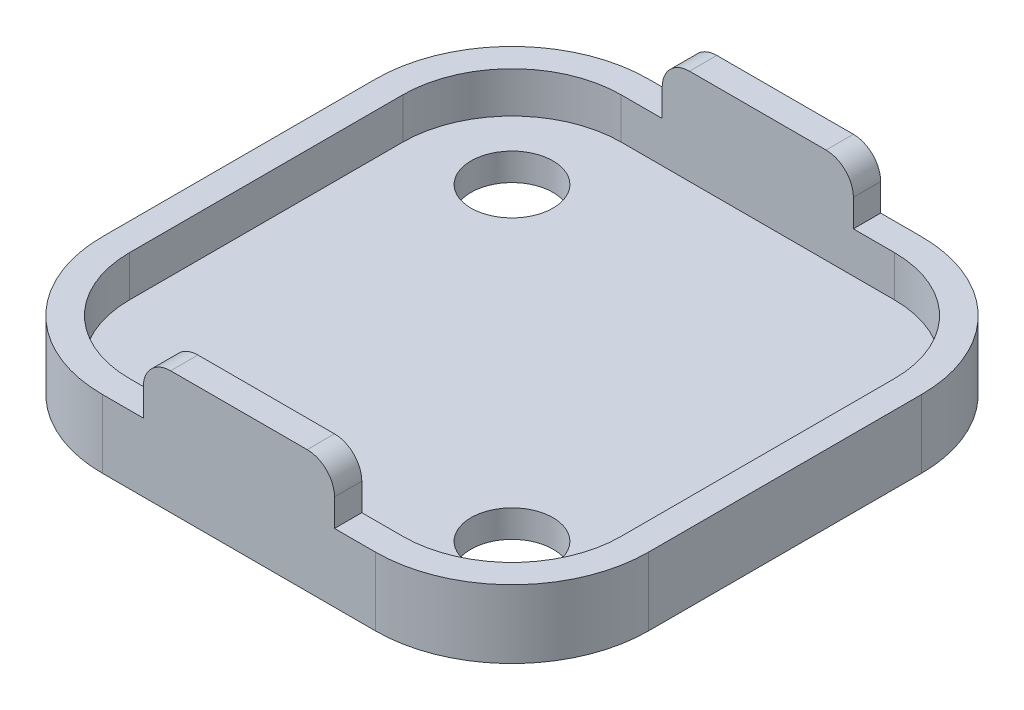
ISO-10303-21;
HEADER;
FILE_DESCRIPTION(('STEP AP214'),'2;1');
FILE_NAME('part.step','',(''),(''),'','','');
FILE_SCHEMA(('AUTOMOTIVE_DESIGN { 1 0 10303 214 1 1 1 1 }'));
ENDSEC;
DATA;
#1=APPLICATION_CONTEXT('core data for automotive mechanical design processes');
#2=APPLICATION_PROTOCOL_DEFINITION('international standard','automotive_design',2000,#1);
#3=PRODUCT_CONTEXT('',#1,'mechanical');
#4=PRODUCT('Part','Part','',(#3));
#5=PRODUCT_RELATED_PRODUCT_CATEGORY('part','',(#4));
#6=PRODUCT_DEFINITION_FORMATION('','',#4);
#7=PRODUCT_DEFINITION_CONTEXT('part definition',#1,'design');
#8=PRODUCT_DEFINITION('design','',#6,#7);
#9=PRODUCT_DEFINITION_SHAPE('','',#8);
#10=(LENGTH_UNIT() NAMED_UNIT(*) SI_UNIT(.MILLI.,.METRE.));
#11=(NAMED_UNIT(*) PLANE_ANGLE_UNIT() SI_UNIT($,.RADIAN.));
#12=(NAMED_UNIT(*) SI_UNIT($,.STERADIAN.) SOLID_ANGLE_UNIT());
#13=UNCERTAINTY_MEASURE_WITH_UNIT(LENGTH_MEASURE(1.E-05),#10,'distance_accuracy_value','');
#14=(GEOMETRIC_REPRESENTATION_CONTEXT(3) GLOBAL_UNCERTAINTY_ASSIGNED_CONTEXT((#13)) GLOBAL_UNIT_ASSIGNED_CONTEXT((#10,
#11,#12)) REPRESENTATION_CONTEXT('',''));
#15=CARTESIAN_POINT('',(0.,0.,0.));
#16=DIRECTION('',(0.,0.,1.));
#17=DIRECTION('',(1.,0.,0.));
#18=AXIS2_PLACEMENT_3D('',#15,#16,#17);
#19=CARTESIAN_POINT('',(0.,2.5,0.));
#20=DIRECTION('',(0.,-1.,0.));
#21=DIRECTION('',(0.,0.,-1.));
#22=AXIS2_PLACEMENT_3D('',#19,#20,#21);
#23=PLANE('',#22);
#24=DIRECTION('',(0.,0.,1.));
#25=VECTOR('',#24,1.);
#26=CARTESIAN_POINT('',(-3.49999999999944,2.5,0.));
#27=LINE('',#26,#25);
#28=CARTESIAN_POINT('',(-3.49999999999944,2.5,9.));
#29=VERTEX_POINT('',#28);
#30=CARTESIAN_POINT('',(-3.49999999999944,2.5,10.));
#31=VERTEX_POINT('',#30);
#32=EDGE_CURVE('E224',#29,#31,#27,.T.);
#33=ORIENTED_EDGE('',*,*,#32,.F.);
#34=DIRECTION('',(1.,0.,0.));
#35=VECTOR('',#34,1.);
#36=CARTESIAN_POINT('',(-5.,2.5,9.));
#37=LINE('',#36,#35);
#38=CARTESIAN_POINT('',(-5.,2.5,9.));
#39=VERTEX_POINT('',#38);
#40=EDGE_CURVE('E237',#39,#29,#37,.T.);
#41=ORIENTED_EDGE('',*,*,#40,.F.);
#42=CARTESIAN_POINT('',(-5.,2.5,5.));
#43=DIRECTION('',(0.,1.,0.));
#44=DIRECTION('',(0.,0.,1.));
#45=AXIS2_PLACEMENT_3D('',#42,#43,#44);
#46=CIRCLE('',#45,4.);
#47=CARTESIAN_POINT('',(-9.,2.5,5.));
#48=VERTEX_POINT('',#47);
#49=EDGE_CURVE('E253',#48,#39,#46,.T.);
#50=ORIENTED_EDGE('',*,*,#49,.F.);
#51=DIRECTION('',(0.,0.,1.));
#52=VECTOR('',#51,1.);
#53=CARTESIAN_POINT('',(-9.,2.5,-5.));
#54=LINE('',#53,#52);
#55=CARTESIAN_POINT('',(-9.,2.5,-5.));
#56=VERTEX_POINT('',#55);
#57=EDGE_CURVE('E443',#56,#48,#54,.T.);
#58=ORIENTED_EDGE('',*,*,#57,.F.);
#59=CARTESIAN_POINT('',(-5.,2.5,-5.));
#60=DIRECTION('',(0.,1.,0.));
#61=DIRECTION('',(0.,0.,1.));
#62=AXIS2_PLACEMENT_3D('',#59,#60,#61);
#63=CIRCLE('',#62,4.);
#64=CARTESIAN_POINT('',(-5.,2.5,-9.));
#65=VERTEX_POINT('',#64);
#66=EDGE_CURVE('E441',#65,#56,#63,.T.);
#67=ORIENTED_EDGE('',*,*,#66,.F.);
#68=DIRECTION('',(-1.,0.,0.));
#69=VECTOR('',#68,1.);
#70=CARTESIAN_POINT('',(5.,2.5,-9.));
#71=LINE('',#70,#69);
#72=CARTESIAN_POINT('',(-3.49999999999943,2.5,-9.));
#73=VERTEX_POINT('',#72);
#74=EDGE_CURVE('E438',#73,#65,#71,.T.);
#75=ORIENTED_EDGE('',*,*,#74,.F.);
#76=DIRECTION('',(0.,0.,1.));
#77=VECTOR('',#76,1.);
#78=CARTESIAN_POINT('',(-3.49999999999944,2.5,0.));
#79=LINE('',#78,#77);
#80=CARTESIAN_POINT('',(-3.49999999999943,2.5,-10.));
#81=VERTEX_POINT('',#80);
#82=EDGE_CURVE('E231',#81,#73,#79,.T.);
#83=ORIENTED_EDGE('',*,*,#82,.F.);
#84=DIRECTION('',(-1.,0.,0.));
#85=VECTOR('',#84,1.);
#86=CARTESIAN_POINT('',(-10.,2.5,-10.));
#87=LINE('',#86,#85);
#88=CARTESIAN_POINT('',(-5.,2.5,-10.));
#89=VERTEX_POINT('',#88);
#90=EDGE_CURVE('E287',#81,#89,#87,.T.);
#91=ORIENTED_EDGE('',*,*,#90,.T.);
#92=CARTESIAN_POINT('',(-5.,2.5,-5.));
#93=DIRECTION('',(0.,-1.,0.));
#94=DIRECTION('',(0.,0.,-1.));
#95=AXIS2_PLACEMENT_3D('',#92,#93,#94);
#96=CIRCLE('',#95,5.);
#97=CARTESIAN_POINT('',(-10.,2.5,-5.));
#98=VERTEX_POINT('',#97);
#99=EDGE_CURVE('E334',#89,#98,#96,.F.);
#100=ORIENTED_EDGE('',*,*,#99,.T.);
#101=DIRECTION('',(0.,0.,1.));
#102=VECTOR('',#101,1.);
#103=CARTESIAN_POINT('',(-10.,2.5,10.));
#104=LINE('',#103,#102);
#105=CARTESIAN_POINT('',(-10.,2.5,5.));
#106=VERTEX_POINT('',#105);
#107=EDGE_CURVE('E292',#98,#106,#104,.T.);
#108=ORIENTED_EDGE('',*,*,#107,.T.);
#109=CARTESIAN_POINT('',(-5.,2.5,5.));
#110=DIRECTION('',(0.,-1.,0.));
#111=DIRECTION('',(0.,0.,-1.));
#112=AXIS2_PLACEMENT_3D('',#109,#110,#111);
#113=CIRCLE('',#112,5.);
#114=CARTESIAN_POINT('',(-5.,2.5,10.));
#115=VERTEX_POINT('',#114);
#116=EDGE_CURVE('E332',#106,#115,#113,.F.);
#117=ORIENTED_EDGE('',*,*,#116,.T.);
#118=DIRECTION('',(1.,0.,0.));
#119=VECTOR('',#118,1.);
#120=CARTESIAN_POINT('',(-10.,2.5,10.));
#121=LINE('',#120,#119);
#122=EDGE_CURVE('E239',#115,#31,#121,.T.);
#123=ORIENTED_EDGE('',*,*,#122,.T.);
#124=EDGE_LOOP('',(#33,#41,#50,#58,#67,#75,#83,#91,#100,#108,#117,#123));
#125=FACE_BOUND('',#124,.T.);
#126=ADVANCED_FACE('F35',(#125),#23,.F.);
#127=DIRECTION('',(0.,0.,-1.));
#128=VECTOR('',#127,1.);
#129=CARTESIAN_POINT('',(3.50000000000056,2.5,0.));
#130=LINE('',#129,#128);
#131=CARTESIAN_POINT('',(3.50000000000056,2.5,10.));
#132=VERTEX_POINT('',#131);
#133=CARTESIAN_POINT('',(3.50000000000056,2.5,9.));
#134=VERTEX_POINT('',#133);
#135=EDGE_CURVE('E240',#132,#134,#130,.T.);
#136=ORIENTED_EDGE('',*,*,#135,.F.);
#137=CARTESIAN_POINT('',(5.,2.5,10.));
#138=VERTEX_POINT('',#137);
#139=EDGE_CURVE('E295',#132,#138,#121,.T.);
#140=ORIENTED_EDGE('',*,*,#139,.T.);
#141=CARTESIAN_POINT('',(5.,2.5,5.));
#142=DIRECTION('',(0.,-1.,0.));
#143=DIRECTION('',(0.,0.,-1.));
#144=AXIS2_PLACEMENT_3D('',#141,#142,#143);
#145=CIRCLE('',#144,5.);
#146=CARTESIAN_POINT('',(10.,2.5,5.));
#147=VERTEX_POINT('',#146);
#148=EDGE_CURVE('E328',#138,#147,#145,.F.);
#149=ORIENTED_EDGE('',*,*,#148,.T.);
#150=DIRECTION('',(0.,0.,-1.));
#151=VECTOR('',#150,1.);
#152=CARTESIAN_POINT('',(10.,2.5,10.));
#153=LINE('',#152,#151);
#154=CARTESIAN_POINT('',(10.,2.5,-5.));
#155=VERTEX_POINT('',#154);
#156=EDGE_CURVE('E284',#147,#155,#153,.T.);
#157=ORIENTED_EDGE('',*,*,#156,.T.);
#158=CARTESIAN_POINT('',(5.,2.5,-5.));
#159=DIRECTION('',(0.,-1.,0.));
#160=DIRECTION('',(0.,0.,-1.));
#161=AXIS2_PLACEMENT_3D('',#158,#159,#160);
#162=CIRCLE('',#161,5.);
#163=CARTESIAN_POINT('',(5.,2.5,-10.));
#164=VERTEX_POINT('',#163);
#165=EDGE_CURVE('E330',#155,#164,#162,.F.);
#166=ORIENTED_EDGE('',*,*,#165,.T.);
#167=CARTESIAN_POINT('',(3.50000000000056,2.5,-10.));
#168=VERTEX_POINT('',#167);
#169=EDGE_CURVE('E289',#164,#168,#87,.T.);
#170=ORIENTED_EDGE('',*,*,#169,.T.);
#171=DIRECTION('',(0.,0.,-1.));
#172=VECTOR('',#171,1.);
#173=CARTESIAN_POINT('',(3.50000000000056,2.5,0.));
#174=LINE('',#173,#172);
#175=CARTESIAN_POINT('',(3.50000000000056,2.5,-9.));
#176=VERTEX_POINT('',#175);
#177=EDGE_CURVE('E404',#176,#168,#174,.T.);
#178=ORIENTED_EDGE('',*,*,#177,.F.);
#179=CARTESIAN_POINT('',(5.,2.5,-9.));
#180=VERTEX_POINT('',#179);
#181=EDGE_CURVE('E439',#180,#176,#71,.T.);
#182=ORIENTED_EDGE('',*,*,#181,.F.);
#183=CARTESIAN_POINT('',(5.,2.5,-5.));
#184=DIRECTION('',(0.,1.,0.));
#185=DIRECTION('',(0.,0.,1.));
#186=AXIS2_PLACEMENT_3D('',#183,#184,#185);
#187=CIRCLE('',#186,4.);
#188=CARTESIAN_POINT('',(9.,2.5,-5.));
#189=VERTEX_POINT('',#188);
#190=EDGE_CURVE('E414',#189,#180,#187,.T.);
#191=ORIENTED_EDGE('',*,*,#190,.F.);
#192=DIRECTION('',(0.,0.,-1.));
#193=VECTOR('',#192,1.);
#194=CARTESIAN_POINT('',(9.,2.5,5.));
#195=LINE('',#194,#193);
#196=CARTESIAN_POINT('',(9.,2.5,5.));
#197=VERTEX_POINT('',#196);
#198=EDGE_CURVE('E251',#197,#189,#195,.T.);
#199=ORIENTED_EDGE('',*,*,#198,.F.);
#200=CARTESIAN_POINT('',(5.,2.5,5.));
#201=DIRECTION('',(0.,1.,0.));
#202=DIRECTION('',(0.,0.,1.));
#203=AXIS2_PLACEMENT_3D('',#200,#201,#202);
#204=CIRCLE('',#203,4.);
#205=CARTESIAN_POINT('',(5.,2.5,9.));
#206=VERTEX_POINT('',#205);
#207=EDGE_CURVE('E247',#206,#197,#204,.T.);
#208=ORIENTED_EDGE('',*,*,#207,.F.);
#209=EDGE_CURVE('E248',#134,#206,#37,.T.);
#210=ORIENTED_EDGE('',*,*,#209,.F.);
#211=EDGE_LOOP('',(#136,#140,#149,#157,#166,#170,#178,#182,#191,#199,#208,#210));
#212=FACE_BOUND('',#211,.T.);
#213=ADVANCED_FACE('F502',(#212),#23,.F.);
#214=CARTESIAN_POINT('',(-5.65685424949239,-7.5,-5.65685424949237));
#215=DIRECTION('',(0.,1.,0.));
#216=DIRECTION('',(0.,0.,1.));
#217=AXIS2_PLACEMENT_3D('',#214,#215,#216);
#218=CYLINDRICAL_SURFACE('',#217,1.50000000000001);
#219=CARTESIAN_POINT('',(-5.65685424949239,0.,-5.65685424949237));
#220=DIRECTION('',(0.,-1.,0.));
#221=DIRECTION('',(0.,0.,-1.));
#222=AXIS2_PLACEMENT_3D('',#219,#220,#221);
#223=CIRCLE('',#222,1.50000000000001);
#224=CARTESIAN_POINT('',(-5.65685424949239,0.,-7.15685424949238));
#225=VERTEX_POINT('',#224);
#226=EDGE_CURVE('E283',#225,#225,#223,.T.);
#227=ORIENTED_EDGE('',*,*,#226,.T.);
#228=EDGE_LOOP('',(#227));
#229=FACE_BOUND('',#228,.T.);
#230=CARTESIAN_POINT('',(-5.65685424949239,1.,-5.65685424949237));
#231=DIRECTION('',(0.,1.,0.));
#232=DIRECTION('',(0.,0.,1.));
#233=AXIS2_PLACEMENT_3D('',#230,#231,#232);
#234=CIRCLE('',#233,1.50000000000001);
#235=CARTESIAN_POINT('',(-5.65685424949239,1.,-4.15685424949236));
#236=VERTEX_POINT('',#235);
#237=EDGE_CURVE('E280',#236,#236,#234,.F.);
#238=ORIENTED_EDGE('',*,*,#237,.F.);
#239=EDGE_LOOP('',(#238));
#240=FACE_BOUND('',#239,.T.);
#241=ADVANCED_FACE('F525',(#229,#240),#218,.F.);
#242=CARTESIAN_POINT('',(5.65685424949239,-7.5,5.65685424949237));
#243=DIRECTION('',(0.,1.,0.));
#244=DIRECTION('',(0.,0.,1.));
#245=AXIS2_PLACEMENT_3D('',#242,#243,#244);
#246=CYLINDRICAL_SURFACE('',#245,1.50000000000001);
#247=CARTESIAN_POINT('',(5.65685424949239,0.,5.65685424949237));
#248=DIRECTION('',(0.,-1.,0.));
#249=DIRECTION('',(0.,0.,-1.));
#250=AXIS2_PLACEMENT_3D('',#247,#248,#249);
#251=CIRCLE('',#250,1.50000000000001);
#252=CARTESIAN_POINT('',(5.65685424949239,0.,4.15685424949236));
#253=VERTEX_POINT('',#252);
#254=EDGE_CURVE('E302',#253,#253,#251,.T.);
#255=ORIENTED_EDGE('',*,*,#254,.T.);
#256=EDGE_LOOP('',(#255));
#257=FACE_BOUND('',#256,.T.);
#258=CARTESIAN_POINT('',(5.65685424949239,1.,5.65685424949237));
#259=DIRECTION('',(0.,1.,0.));
#260=DIRECTION('',(0.,0.,1.));
#261=AXIS2_PLACEMENT_3D('',#258,#259,#260);
#262=CIRCLE('',#261,1.50000000000001);
#263=CARTESIAN_POINT('',(5.65685424949239,1.,7.15685424949238));
#264=VERTEX_POINT('',#263);
#265=EDGE_CURVE('E262',#264,#264,#262,.F.);
#266=ORIENTED_EDGE('',*,*,#265,.F.);
#267=EDGE_LOOP('',(#266));
#268=FACE_BOUND('',#267,.T.);
#269=ADVANCED_FACE('F545',(#257,#268),#246,.F.);
#270=CARTESIAN_POINT('',(10.,2.5,10.));
#271=DIRECTION('',(-1.,0.,0.));
#272=DIRECTION('',(0.,0.,1.));
#273=AXIS2_PLACEMENT_3D('',#270,#271,#272);
#274=PLANE('',#273);
#275=DIRECTION('',(0.,0.,-1.));
#276=VECTOR('',#275,1.);
#277=CARTESIAN_POINT('',(10.,0.,10.));
#278=LINE('',#277,#276);
#279=CARTESIAN_POINT('',(10.,0.,5.));
#280=VERTEX_POINT('',#279);
#281=CARTESIAN_POINT('',(10.,0.,-5.));
#282=VERTEX_POINT('',#281);
#283=EDGE_CURVE('E298',#280,#282,#278,.T.);
#284=ORIENTED_EDGE('',*,*,#283,.T.);
#285=DIRECTION('',(0.,-1.,0.));
#286=VECTOR('',#285,1.);
#287=CARTESIAN_POINT('',(10.,2.5,-5.));
#288=LINE('',#287,#286);
#289=EDGE_CURVE('E345',#282,#155,#288,.F.);
#290=ORIENTED_EDGE('',*,*,#289,.T.);
#291=ORIENTED_EDGE('',*,*,#156,.F.);
#292=DIRECTION('',(0.,-1.,0.));
#293=VECTOR('',#292,1.);
#294=CARTESIAN_POINT('',(10.,2.5,5.));
#295=LINE('',#294,#293);
#296=EDGE_CURVE('E342',#147,#280,#295,.T.);
#297=ORIENTED_EDGE('',*,*,#296,.T.);
#298=EDGE_LOOP('',(#284,#290,#291,#297));
#299=FACE_BOUND('',#298,.T.);
#300=ADVANCED_FACE('F542',(#299),#274,.F.);
#301=CARTESIAN_POINT('',(-10.,2.5,-10.));
#302=DIRECTION('',(0.,0.,1.));
#303=DIRECTION('',(1.,0.,0.));
#304=AXIS2_PLACEMENT_3D('',#301,#302,#303);
#305=PLANE('',#304);
#306=DIRECTION('',(-1.,0.,0.));
#307=VECTOR('',#306,1.);
#308=CARTESIAN_POINT('',(0.,4.5,-10.));
#309=LINE('',#308,#307);
#310=CARTESIAN_POINT('',(2.50000000000057,4.5,-10.));
#311=VERTEX_POINT('',#310);
#312=CARTESIAN_POINT('',(-2.49999999999943,4.5,-10.));
#313=VERTEX_POINT('',#312);
#314=EDGE_CURVE('E395',#311,#313,#309,.T.);
#315=ORIENTED_EDGE('',*,*,#314,.F.);
#316=CARTESIAN_POINT('',(2.50000000000057,3.5,-10.));
#317=DIRECTION('',(0.,0.,1.));
#318=DIRECTION('',(1.,0.,0.));
#319=AXIS2_PLACEMENT_3D('',#316,#317,#318);
#320=CIRCLE('',#319,1.);
#321=CARTESIAN_POINT('',(3.50000000000056,3.5,-10.));
#322=VERTEX_POINT('',#321);
#323=EDGE_CURVE('E378',#311,#322,#320,.F.);
#324=ORIENTED_EDGE('',*,*,#323,.T.);
#325=DIRECTION('',(0.,-1.,0.));
#326=VECTOR('',#325,1.);
#327=CARTESIAN_POINT('',(3.50000000000056,4.5,-10.));
#328=LINE('',#327,#326);
#329=EDGE_CURVE('E394',#322,#168,#328,.T.);
#330=ORIENTED_EDGE('',*,*,#329,.T.);
#331=ORIENTED_EDGE('',*,*,#169,.F.);
#332=DIRECTION('',(0.,-1.,0.));
#333=VECTOR('',#332,1.);
#334=CARTESIAN_POINT('',(5.,2.5,-10.));
#335=LINE('',#334,#333);
#336=CARTESIAN_POINT('',(5.,0.,-10.));
#337=VERTEX_POINT('',#336);
#338=EDGE_CURVE('E322',#164,#337,#335,.T.);
#339=ORIENTED_EDGE('',*,*,#338,.T.);
#340=DIRECTION('',(-1.,0.,0.));
#341=VECTOR('',#340,1.);
#342=CARTESIAN_POINT('',(-10.,0.,-10.));
#343=LINE('',#342,#341);
#344=CARTESIAN_POINT('',(-5.,0.,-10.));
#345=VERTEX_POINT('',#344);
#346=EDGE_CURVE('E301',#337,#345,#343,.T.);
#347=ORIENTED_EDGE('',*,*,#346,.T.);
#348=DIRECTION('',(0.,-1.,0.));
#349=VECTOR('',#348,1.);
#350=CARTESIAN_POINT('',(-5.,2.5,-10.));
#351=LINE('',#350,#349);
#352=EDGE_CURVE('E325',#345,#89,#351,.F.);
#353=ORIENTED_EDGE('',*,*,#352,.T.);
#354=ORIENTED_EDGE('',*,*,#90,.F.);
#355=DIRECTION('',(0.,-1.,0.));
#356=VECTOR('',#355,1.);
#357=CARTESIAN_POINT('',(-3.49999999999944,4.5,-10.));
#358=LINE('',#357,#356);
#359=CARTESIAN_POINT('',(-3.49999999999944,3.5,-10.));
#360=VERTEX_POINT('',#359);
#361=EDGE_CURVE('E412',#360,#81,#358,.T.);
#362=ORIENTED_EDGE('',*,*,#361,.F.);
#363=CARTESIAN_POINT('',(-2.49999999999943,3.5,-10.));
#364=DIRECTION('',(0.,0.,1.));
#365=DIRECTION('',(1.,0.,0.));
#366=AXIS2_PLACEMENT_3D('',#363,#364,#365);
#367=CIRCLE('',#366,1.);
#368=EDGE_CURVE('E376',#360,#313,#367,.F.);
#369=ORIENTED_EDGE('',*,*,#368,.T.);
#370=EDGE_LOOP('',(#315,#324,#330,#331,#339,#347,#353,#354,#362,#369));
#371=FACE_BOUND('',#370,.T.);
#372=ADVANCED_FACE('F399',(#371),#305,.F.);
#373=CARTESIAN_POINT('',(-10.,2.5,10.));
#374=DIRECTION('',(1.,0.,0.));
#375=DIRECTION('',(0.,0.,-1.));
#376=AXIS2_PLACEMENT_3D('',#373,#374,#375);
#377=PLANE('',#376);
#378=ORIENTED_EDGE('',*,*,#107,.F.);
#379=DIRECTION('',(0.,-1.,0.));
#380=VECTOR('',#379,1.);
#381=CARTESIAN_POINT('',(-10.,2.5,-5.));
#382=LINE('',#381,#380);
#383=CARTESIAN_POINT('',(-10.,0.,-5.));
#384=VERTEX_POINT('',#383);
#385=EDGE_CURVE('E311',#98,#384,#382,.T.);
#386=ORIENTED_EDGE('',*,*,#385,.T.);
#387=DIRECTION('',(0.,0.,1.));
#388=VECTOR('',#387,1.);
#389=CARTESIAN_POINT('',(-10.,0.,10.));
#390=LINE('',#389,#388);
#391=CARTESIAN_POINT('',(-10.,0.,5.));
#392=VERTEX_POINT('',#391);
#393=EDGE_CURVE('E305',#384,#392,#390,.T.);
#394=ORIENTED_EDGE('',*,*,#393,.T.);
#395=DIRECTION('',(0.,-1.,0.));
#396=VECTOR('',#395,1.);
#397=CARTESIAN_POINT('',(-10.,2.5,5.));
#398=LINE('',#397,#396);
#399=EDGE_CURVE('E297',#392,#106,#398,.F.);
#400=ORIENTED_EDGE('',*,*,#399,.T.);
#401=EDGE_LOOP('',(#378,#386,#394,#400));
#402=FACE_BOUND('',#401,.T.);
#403=ADVANCED_FACE('F536',(#402),#377,.F.);
#404=CARTESIAN_POINT('',(-10.,2.5,10.));
#405=DIRECTION('',(0.,0.,-1.));
#406=DIRECTION('',(-1.,0.,0.));
#407=AXIS2_PLACEMENT_3D('',#404,#405,#406);
#408=PLANE('',#407);
#409=DIRECTION('',(0.,-1.,0.));
#410=VECTOR('',#409,1.);
#411=CARTESIAN_POINT('',(3.50000000000056,4.5,10.));
#412=LINE('',#411,#410);
#413=CARTESIAN_POINT('',(3.50000000000056,3.5,10.));
#414=VERTEX_POINT('',#413);
#415=EDGE_CURVE('E469',#414,#132,#412,.T.);
#416=ORIENTED_EDGE('',*,*,#415,.F.);
#417=CARTESIAN_POINT('',(2.50000000000055,3.5,10.));
#418=DIRECTION('',(0.,0.,-1.));
#419=DIRECTION('',(-1.,0.,0.));
#420=AXIS2_PLACEMENT_3D('',#417,#418,#419);
#421=CIRCLE('',#420,1.);
#422=CARTESIAN_POINT('',(2.50000000000055,4.5,10.));
#423=VERTEX_POINT('',#422);
#424=EDGE_CURVE('E367',#414,#423,#421,.F.);
#425=ORIENTED_EDGE('',*,*,#424,.T.);
#426=DIRECTION('',(1.,0.,0.));
#427=VECTOR('',#426,1.);
#428=CARTESIAN_POINT('',(0.,4.5,10.));
#429=LINE('',#428,#427);
#430=CARTESIAN_POINT('',(-2.49999999999944,4.5,10.));
#431=VERTEX_POINT('',#430);
#432=EDGE_CURVE('E473',#431,#423,#429,.T.);
#433=ORIENTED_EDGE('',*,*,#432,.F.);
#434=CARTESIAN_POINT('',(-2.49999999999944,3.5,10.));
#435=DIRECTION('',(0.,0.,-1.));
#436=DIRECTION('',(-1.,0.,0.));
#437=AXIS2_PLACEMENT_3D('',#434,#435,#436);
#438=CIRCLE('',#437,1.);
#439=CARTESIAN_POINT('',(-3.49999999999944,3.5,10.));
#440=VERTEX_POINT('',#439);
#441=EDGE_CURVE('E365',#431,#440,#438,.F.);
#442=ORIENTED_EDGE('',*,*,#441,.T.);
#443=DIRECTION('',(0.,-1.,0.));
#444=VECTOR('',#443,1.);
#445=CARTESIAN_POINT('',(-3.49999999999944,4.5,10.));
#446=LINE('',#445,#444);
#447=EDGE_CURVE('E232',#440,#31,#446,.T.);
#448=ORIENTED_EDGE('',*,*,#447,.T.);
#449=ORIENTED_EDGE('',*,*,#122,.F.);
#450=DIRECTION('',(0.,-1.,0.));
#451=VECTOR('',#450,1.);
#452=CARTESIAN_POINT('',(-5.,2.5,10.));
#453=LINE('',#452,#451);
#454=CARTESIAN_POINT('',(-5.,0.,10.));
#455=VERTEX_POINT('',#454);
#456=EDGE_CURVE('E339',#115,#455,#453,.T.);
#457=ORIENTED_EDGE('',*,*,#456,.T.);
#458=DIRECTION('',(1.,0.,0.));
#459=VECTOR('',#458,1.);
#460=CARTESIAN_POINT('',(-10.,0.,10.));
#461=LINE('',#460,#459);
#462=CARTESIAN_POINT('',(5.,0.,10.));
#463=VERTEX_POINT('',#462);
#464=EDGE_CURVE('E288',#455,#463,#461,.T.);
#465=ORIENTED_EDGE('',*,*,#464,.T.);
#466=DIRECTION('',(0.,-1.,0.));
#467=VECTOR('',#466,1.);
#468=CARTESIAN_POINT('',(5.,2.5,10.));
#469=LINE('',#468,#467);
#470=EDGE_CURVE('E336',#463,#138,#469,.F.);
#471=ORIENTED_EDGE('',*,*,#470,.T.);
#472=ORIENTED_EDGE('',*,*,#139,.F.);
#473=EDGE_LOOP('',(#416,#425,#433,#442,#448,#449,#457,#465,#471,#472));
#474=FACE_BOUND('',#473,.T.);
#475=ADVANCED_FACE('F489',(#474),#408,.F.);
#476=CARTESIAN_POINT('',(0.,0.,0.));
#477=DIRECTION('',(0.,-1.,0.));
#478=DIRECTION('',(0.,0.,-1.));
#479=AXIS2_PLACEMENT_3D('',#476,#477,#478);
#480=PLANE('',#479);
#481=ORIENTED_EDGE('',*,*,#254,.F.);
#482=EDGE_LOOP('',(#481));
#483=FACE_BOUND('',#482,.T.);
#484=ORIENTED_EDGE('',*,*,#226,.F.);
#485=EDGE_LOOP('',(#484));
#486=FACE_BOUND('',#485,.T.);
#487=ORIENTED_EDGE('',*,*,#393,.F.);
#488=CARTESIAN_POINT('',(-5.,0.,-5.));
#489=DIRECTION('',(0.,-1.,0.));
#490=DIRECTION('',(0.,0.,-1.));
#491=AXIS2_PLACEMENT_3D('',#488,#489,#490);
#492=CIRCLE('',#491,5.);
#493=EDGE_CURVE('E320',#384,#345,#492,.T.);
#494=ORIENTED_EDGE('',*,*,#493,.T.);
#495=ORIENTED_EDGE('',*,*,#346,.F.);
#496=CARTESIAN_POINT('',(5.,0.,-5.));
#497=DIRECTION('',(0.,-1.,0.));
#498=DIRECTION('',(0.,0.,-1.));
#499=AXIS2_PLACEMENT_3D('',#496,#497,#498);
#500=CIRCLE('',#499,5.);
#501=EDGE_CURVE('E316',#337,#282,#500,.T.);
#502=ORIENTED_EDGE('',*,*,#501,.T.);
#503=ORIENTED_EDGE('',*,*,#283,.F.);
#504=CARTESIAN_POINT('',(5.,0.,5.));
#505=DIRECTION('',(0.,-1.,0.));
#506=DIRECTION('',(0.,0.,-1.));
#507=AXIS2_PLACEMENT_3D('',#504,#505,#506);
#508=CIRCLE('',#507,5.);
#509=EDGE_CURVE('E314',#280,#463,#508,.T.);
#510=ORIENTED_EDGE('',*,*,#509,.T.);
#511=ORIENTED_EDGE('',*,*,#464,.F.);
#512=CARTESIAN_POINT('',(-5.,0.,5.));
#513=DIRECTION('',(0.,-1.,0.));
#514=DIRECTION('',(0.,0.,-1.));
#515=AXIS2_PLACEMENT_3D('',#512,#513,#514);
#516=CIRCLE('',#515,5.);
#517=EDGE_CURVE('E318',#455,#392,#516,.T.);
#518=ORIENTED_EDGE('',*,*,#517,.T.);
#519=EDGE_LOOP('',(#487,#494,#495,#502,#503,#510,#511,#518));
#520=FACE_BOUND('',#519,.T.);
#521=ADVANCED_FACE('F529',(#483,#486,#520),#480,.T.);
#522=CARTESIAN_POINT('',(-5.,2.5,-5.));
#523=DIRECTION('',(0.,-1.,0.));
#524=DIRECTION('',(0.,0.,-1.));
#525=AXIS2_PLACEMENT_3D('',#522,#523,#524);
#526=CYLINDRICAL_SURFACE('',#525,5.);
#527=ORIENTED_EDGE('',*,*,#99,.F.);
#528=ORIENTED_EDGE('',*,*,#352,.F.);
#529=ORIENTED_EDGE('',*,*,#493,.F.);
#530=ORIENTED_EDGE('',*,*,#385,.F.);
#531=EDGE_LOOP('',(#527,#528,#529,#530));
#532=FACE_BOUND('',#531,.T.);
#533=ADVANCED_FACE('F532',(#532),#526,.T.);
#534=CARTESIAN_POINT('',(-5.,2.5,5.));
#535=DIRECTION('',(0.,-1.,0.));
#536=DIRECTION('',(0.,0.,-1.));
#537=AXIS2_PLACEMENT_3D('',#534,#535,#536);
#538=CYLINDRICAL_SURFACE('',#537,5.);
#539=ORIENTED_EDGE('',*,*,#116,.F.);
#540=ORIENTED_EDGE('',*,*,#399,.F.);
#541=ORIENTED_EDGE('',*,*,#517,.F.);
#542=ORIENTED_EDGE('',*,*,#456,.F.);
#543=EDGE_LOOP('',(#539,#540,#541,#542));
#544=FACE_BOUND('',#543,.T.);
#545=ADVANCED_FACE('F549',(#544),#538,.T.);
#546=CARTESIAN_POINT('',(5.,2.5,-5.));
#547=DIRECTION('',(0.,-1.,0.));
#548=DIRECTION('',(0.,0.,-1.));
#549=AXIS2_PLACEMENT_3D('',#546,#547,#548);
#550=CYLINDRICAL_SURFACE('',#549,5.);
#551=ORIENTED_EDGE('',*,*,#165,.F.);
#552=ORIENTED_EDGE('',*,*,#289,.F.);
#553=ORIENTED_EDGE('',*,*,#501,.F.);
#554=ORIENTED_EDGE('',*,*,#338,.F.);
#555=EDGE_LOOP('',(#551,#552,#553,#554));
#556=FACE_BOUND('',#555,.T.);
#557=ADVANCED_FACE('F553',(#556),#550,.T.);
#558=CARTESIAN_POINT('',(5.,2.5,5.));
#559=DIRECTION('',(0.,-1.,0.));
#560=DIRECTION('',(0.,0.,-1.));
#561=AXIS2_PLACEMENT_3D('',#558,#559,#560);
#562=CYLINDRICAL_SURFACE('',#561,5.);
#563=ORIENTED_EDGE('',*,*,#148,.F.);
#564=ORIENTED_EDGE('',*,*,#470,.F.);
#565=ORIENTED_EDGE('',*,*,#509,.F.);
#566=ORIENTED_EDGE('',*,*,#296,.F.);
#567=EDGE_LOOP('',(#563,#564,#565,#566));
#568=FACE_BOUND('',#567,.T.);
#569=ADVANCED_FACE('F557',(#568),#562,.T.);
#570=CARTESIAN_POINT('',(5.,1.,-5.));
#571=DIRECTION('',(0.,1.,0.));
#572=DIRECTION('',(0.,0.,1.));
#573=AXIS2_PLACEMENT_3D('',#570,#571,#572);
#574=PLANE('',#573);
#575=CARTESIAN_POINT('',(5.,1.,-5.));
#576=DIRECTION('',(0.,1.,0.));
#577=DIRECTION('',(0.,0.,1.));
#578=AXIS2_PLACEMENT_3D('',#575,#576,#577);
#579=CIRCLE('',#578,4.);
#580=CARTESIAN_POINT('',(9.,1.,-5.));
#581=VERTEX_POINT('',#580);
#582=CARTESIAN_POINT('',(5.,1.,-9.));
#583=VERTEX_POINT('',#582);
#584=EDGE_CURVE('E259',#581,#583,#579,.T.);
#585=ORIENTED_EDGE('',*,*,#584,.T.);
#586=DIRECTION('',(-1.,0.,0.));
#587=VECTOR('',#586,1.);
#588=CARTESIAN_POINT('',(5.,1.,-9.));
#589=LINE('',#588,#587);
#590=CARTESIAN_POINT('',(-5.,1.,-9.));
#591=VERTEX_POINT('',#590);
#592=EDGE_CURVE('E417',#583,#591,#589,.T.);
#593=ORIENTED_EDGE('',*,*,#592,.T.);
#594=CARTESIAN_POINT('',(-5.,1.,-5.));
#595=DIRECTION('',(0.,1.,0.));
#596=DIRECTION('',(0.,0.,1.));
#597=AXIS2_PLACEMENT_3D('',#594,#595,#596);
#598=CIRCLE('',#597,4.);
#599=CARTESIAN_POINT('',(-9.,1.,-5.));
#600=VERTEX_POINT('',#599);
#601=EDGE_CURVE('E420',#591,#600,#598,.T.);
#602=ORIENTED_EDGE('',*,*,#601,.T.);
#603=DIRECTION('',(0.,0.,1.));
#604=VECTOR('',#603,1.);
#605=CARTESIAN_POINT('',(-9.,1.,-5.));
#606=LINE('',#605,#604);
#607=CARTESIAN_POINT('',(-9.,1.,5.));
#608=VERTEX_POINT('',#607);
#609=EDGE_CURVE('E423',#600,#608,#606,.T.);
#610=ORIENTED_EDGE('',*,*,#609,.T.);
#611=CARTESIAN_POINT('',(-5.,1.,5.));
#612=DIRECTION('',(0.,1.,0.));
#613=DIRECTION('',(0.,0.,1.));
#614=AXIS2_PLACEMENT_3D('',#611,#612,#613);
#615=CIRCLE('',#614,4.);
#616=CARTESIAN_POINT('',(-5.,1.,9.));
#617=VERTEX_POINT('',#616);
#618=EDGE_CURVE('E426',#608,#617,#615,.T.);
#619=ORIENTED_EDGE('',*,*,#618,.T.);
#620=DIRECTION('',(1.,0.,0.));
#621=VECTOR('',#620,1.);
#622=CARTESIAN_POINT('',(-5.,1.,9.));
#623=LINE('',#622,#621);
#624=CARTESIAN_POINT('',(5.,1.,9.));
#625=VERTEX_POINT('',#624);
#626=EDGE_CURVE('E429',#617,#625,#623,.T.);
#627=ORIENTED_EDGE('',*,*,#626,.T.);
#628=CARTESIAN_POINT('',(5.,1.,5.));
#629=DIRECTION('',(0.,1.,0.));
#630=DIRECTION('',(0.,0.,1.));
#631=AXIS2_PLACEMENT_3D('',#628,#629,#630);
#632=CIRCLE('',#631,4.);
#633=CARTESIAN_POINT('',(9.,1.,5.));
#634=VERTEX_POINT('',#633);
#635=EDGE_CURVE('E432',#625,#634,#632,.T.);
#636=ORIENTED_EDGE('',*,*,#635,.T.);
#637=DIRECTION('',(0.,0.,-1.));
#638=VECTOR('',#637,1.);
#639=CARTESIAN_POINT('',(9.,1.,5.));
#640=LINE('',#639,#638);
#641=EDGE_CURVE('E279',#634,#581,#640,.T.);
#642=ORIENTED_EDGE('',*,*,#641,.T.);
#643=EDGE_LOOP('',(#585,#593,#602,#610,#619,#627,#636,#642));
#644=FACE_BOUND('',#643,.T.);
#645=ORIENTED_EDGE('',*,*,#265,.T.);
#646=EDGE_LOOP('',(#645));
#647=FACE_BOUND('',#646,.T.);
#648=ORIENTED_EDGE('',*,*,#237,.T.);
#649=EDGE_LOOP('',(#648));
#650=FACE_BOUND('',#649,.T.);
#651=ADVANCED_FACE('F509',(#644,#647,#650),#574,.T.);
#652=CARTESIAN_POINT('',(5.,1.,-5.));
#653=DIRECTION('',(0.,1.,0.));
#654=DIRECTION('',(0.,0.,1.));
#655=AXIS2_PLACEMENT_3D('',#652,#653,#654);
#656=CYLINDRICAL_SURFACE('',#655,4.);
#657=ORIENTED_EDGE('',*,*,#190,.T.);
#658=DIRECTION('',(0.,1.,0.));
#659=VECTOR('',#658,1.);
#660=CARTESIAN_POINT('',(5.,1.,-9.));
#661=LINE('',#660,#659);
#662=EDGE_CURVE('E276',#583,#180,#661,.T.);
#663=ORIENTED_EDGE('',*,*,#662,.F.);
#664=ORIENTED_EDGE('',*,*,#584,.F.);
#665=DIRECTION('',(0.,1.,0.));
#666=VECTOR('',#665,1.);
#667=CARTESIAN_POINT('',(9.,1.,-5.));
#668=LINE('',#667,#666);
#669=EDGE_CURVE('E260',#581,#189,#668,.T.);
#670=ORIENTED_EDGE('',*,*,#669,.T.);
#671=EDGE_LOOP('',(#657,#663,#664,#670));
#672=FACE_BOUND('',#671,.T.);
#673=ADVANCED_FACE('F691',(#672),#656,.F.);
#674=CARTESIAN_POINT('',(9.,1.,5.));
#675=DIRECTION('',(1.,0.,0.));
#676=DIRECTION('',(0.,0.,-1.));
#677=AXIS2_PLACEMENT_3D('',#674,#675,#676);
#678=PLANE('',#677);
#679=ORIENTED_EDGE('',*,*,#198,.T.);
#680=ORIENTED_EDGE('',*,*,#669,.F.);
#681=ORIENTED_EDGE('',*,*,#641,.F.);
#682=DIRECTION('',(0.,1.,0.));
#683=VECTOR('',#682,1.);
#684=CARTESIAN_POINT('',(9.,1.,5.));
#685=LINE('',#684,#683);
#686=EDGE_CURVE('E263',#634,#197,#685,.T.);
#687=ORIENTED_EDGE('',*,*,#686,.T.);
#688=EDGE_LOOP('',(#679,#680,#681,#687));
#689=FACE_BOUND('',#688,.T.);
#690=ADVANCED_FACE('F682',(#689),#678,.F.);
#691=CARTESIAN_POINT('',(5.,1.,5.));
#692=DIRECTION('',(0.,1.,0.));
#693=DIRECTION('',(0.,0.,1.));
#694=AXIS2_PLACEMENT_3D('',#691,#692,#693);
#695=CYLINDRICAL_SURFACE('',#694,4.);
#696=ORIENTED_EDGE('',*,*,#207,.T.);
#697=ORIENTED_EDGE('',*,*,#686,.F.);
#698=ORIENTED_EDGE('',*,*,#635,.F.);
#699=DIRECTION('',(0.,1.,0.));
#700=VECTOR('',#699,1.);
#701=CARTESIAN_POINT('',(5.,1.,9.));
#702=LINE('',#701,#700);
#703=EDGE_CURVE('E265',#625,#206,#702,.T.);
#704=ORIENTED_EDGE('',*,*,#703,.T.);
#705=EDGE_LOOP('',(#696,#697,#698,#704));
#706=FACE_BOUND('',#705,.T.);
#707=ADVANCED_FACE('F506',(#706),#695,.F.);
#708=CARTESIAN_POINT('',(-5.,1.,9.));
#709=DIRECTION('',(0.,0.,1.));
#710=DIRECTION('',(1.,0.,0.));
#711=AXIS2_PLACEMENT_3D('',#708,#709,#710);
#712=PLANE('',#711);
#713=DIRECTION('',(-1.,0.,0.));
#714=VECTOR('',#713,1.);
#715=CARTESIAN_POINT('',(0.,4.5,9.));
#716=LINE('',#715,#714);
#717=CARTESIAN_POINT('',(2.50000000000056,4.5,9.));
#718=VERTEX_POINT('',#717);
#719=CARTESIAN_POINT('',(-2.49999999999944,4.5,9.));
#720=VERTEX_POINT('',#719);
#721=EDGE_CURVE('E475',#718,#720,#716,.T.);
#722=ORIENTED_EDGE('',*,*,#721,.F.);
#723=CARTESIAN_POINT('',(2.50000000000056,3.5,9.));
#724=DIRECTION('',(0.,0.,1.));
#725=DIRECTION('',(1.,0.,0.));
#726=AXIS2_PLACEMENT_3D('',#723,#724,#725);
#727=CIRCLE('',#726,1.);
#728=CARTESIAN_POINT('',(3.50000000000056,3.5,9.));
#729=VERTEX_POINT('',#728);
#730=EDGE_CURVE('E361',#718,#729,#727,.F.);
#731=ORIENTED_EDGE('',*,*,#730,.T.);
#732=DIRECTION('',(0.,-1.,0.));
#733=VECTOR('',#732,1.);
#734=CARTESIAN_POINT('',(3.50000000000056,4.5,9.));
#735=LINE('',#734,#733);
#736=EDGE_CURVE('E471',#729,#134,#735,.T.);
#737=ORIENTED_EDGE('',*,*,#736,.T.);
#738=ORIENTED_EDGE('',*,*,#209,.T.);
#739=ORIENTED_EDGE('',*,*,#703,.F.);
#740=ORIENTED_EDGE('',*,*,#626,.F.);
#741=DIRECTION('',(0.,1.,0.));
#742=VECTOR('',#741,1.);
#743=CARTESIAN_POINT('',(-5.,1.,9.));
#744=LINE('',#743,#742);
#745=EDGE_CURVE('E245',#617,#39,#744,.T.);
#746=ORIENTED_EDGE('',*,*,#745,.T.);
#747=ORIENTED_EDGE('',*,*,#40,.T.);
#748=DIRECTION('',(0.,-1.,0.));
#749=VECTOR('',#748,1.);
#750=CARTESIAN_POINT('',(-3.49999999999944,4.5,9.));
#751=LINE('',#750,#749);
#752=CARTESIAN_POINT('',(-3.49999999999944,3.5,9.));
#753=VERTEX_POINT('',#752);
#754=EDGE_CURVE('E220',#753,#29,#751,.T.);
#755=ORIENTED_EDGE('',*,*,#754,.F.);
#756=CARTESIAN_POINT('',(-2.49999999999944,3.5,9.));
#757=DIRECTION('',(0.,0.,1.));
#758=DIRECTION('',(1.,0.,0.));
#759=AXIS2_PLACEMENT_3D('',#756,#757,#758);
#760=CIRCLE('',#759,1.);
#761=EDGE_CURVE('E359',#753,#720,#760,.F.);
#762=ORIENTED_EDGE('',*,*,#761,.T.);
#763=EDGE_LOOP('',(#722,#731,#737,#738,#739,#740,#746,#747,#755,#762));
#764=FACE_BOUND('',#763,.T.);
#765=ADVANCED_FACE('F243',(#764),#712,.F.);
#766=CARTESIAN_POINT('',(-5.,1.,5.));
#767=DIRECTION('',(0.,1.,0.));
#768=DIRECTION('',(0.,0.,1.));
#769=AXIS2_PLACEMENT_3D('',#766,#767,#768);
#770=CYLINDRICAL_SURFACE('',#769,4.);
#771=ORIENTED_EDGE('',*,*,#49,.T.);
#772=ORIENTED_EDGE('',*,*,#745,.F.);
#773=ORIENTED_EDGE('',*,*,#618,.F.);
#774=DIRECTION('',(0.,1.,0.));
#775=VECTOR('',#774,1.);
#776=CARTESIAN_POINT('',(-9.,1.,5.));
#777=LINE('',#776,#775);
#778=EDGE_CURVE('E269',#608,#48,#777,.T.);
#779=ORIENTED_EDGE('',*,*,#778,.T.);
#780=EDGE_LOOP('',(#771,#772,#773,#779));
#781=FACE_BOUND('',#780,.T.);
#782=ADVANCED_FACE('F448',(#781),#770,.F.);
#783=CARTESIAN_POINT('',(-9.,1.,-5.));
#784=DIRECTION('',(-1.,0.,0.));
#785=DIRECTION('',(0.,0.,1.));
#786=AXIS2_PLACEMENT_3D('',#783,#784,#785);
#787=PLANE('',#786);
#788=ORIENTED_EDGE('',*,*,#57,.T.);
#789=ORIENTED_EDGE('',*,*,#778,.F.);
#790=ORIENTED_EDGE('',*,*,#609,.F.);
#791=DIRECTION('',(0.,1.,0.));
#792=VECTOR('',#791,1.);
#793=CARTESIAN_POINT('',(-9.,1.,-5.));
#794=LINE('',#793,#792);
#795=EDGE_CURVE('E271',#600,#56,#794,.T.);
#796=ORIENTED_EDGE('',*,*,#795,.T.);
#797=EDGE_LOOP('',(#788,#789,#790,#796));
#798=FACE_BOUND('',#797,.T.);
#799=ADVANCED_FACE('F511',(#798),#787,.F.);
#800=CARTESIAN_POINT('',(-5.,1.,-5.));
#801=DIRECTION('',(0.,1.,0.));
#802=DIRECTION('',(0.,0.,1.));
#803=AXIS2_PLACEMENT_3D('',#800,#801,#802);
#804=CYLINDRICAL_SURFACE('',#803,4.);
#805=ORIENTED_EDGE('',*,*,#66,.T.);
#806=ORIENTED_EDGE('',*,*,#795,.F.);
#807=ORIENTED_EDGE('',*,*,#601,.F.);
#808=DIRECTION('',(0.,1.,0.));
#809=VECTOR('',#808,1.);
#810=CARTESIAN_POINT('',(-5.,1.,-9.));
#811=LINE('',#810,#809);
#812=EDGE_CURVE('E273',#591,#65,#811,.T.);
#813=ORIENTED_EDGE('',*,*,#812,.T.);
#814=EDGE_LOOP('',(#805,#806,#807,#813));
#815=FACE_BOUND('',#814,.T.);
#816=ADVANCED_FACE('F455',(#815),#804,.F.);
#817=CARTESIAN_POINT('',(5.,1.,-9.));
#818=DIRECTION('',(0.,0.,-1.));
#819=DIRECTION('',(-1.,0.,0.));
#820=AXIS2_PLACEMENT_3D('',#817,#818,#819);
#821=PLANE('',#820);
#822=DIRECTION('',(0.,-1.,0.));
#823=VECTOR('',#822,1.);
#824=CARTESIAN_POINT('',(3.50000000000056,4.5,-9.));
#825=LINE('',#824,#823);
#826=CARTESIAN_POINT('',(3.50000000000056,3.5,-9.));
#827=VERTEX_POINT('',#826);
#828=EDGE_CURVE('E386',#827,#176,#825,.T.);
#829=ORIENTED_EDGE('',*,*,#828,.F.);
#830=CARTESIAN_POINT('',(2.50000000000057,3.5,-9.));
#831=DIRECTION('',(0.,0.,-1.));
#832=DIRECTION('',(-1.,0.,0.));
#833=AXIS2_PLACEMENT_3D('',#830,#831,#832);
#834=CIRCLE('',#833,1.);
#835=CARTESIAN_POINT('',(2.50000000000057,4.5,-9.));
#836=VERTEX_POINT('',#835);
#837=EDGE_CURVE('E43',#827,#836,#834,.F.);
#838=ORIENTED_EDGE('',*,*,#837,.T.);
#839=DIRECTION('',(1.,0.,0.));
#840=VECTOR('',#839,1.);
#841=CARTESIAN_POINT('',(0.,4.5,-9.));
#842=LINE('',#841,#840);
#843=CARTESIAN_POINT('',(-2.49999999999943,4.5,-9.));
#844=VERTEX_POINT('',#843);
#845=EDGE_CURVE('E384',#844,#836,#842,.T.);
#846=ORIENTED_EDGE('',*,*,#845,.F.);
#847=CARTESIAN_POINT('',(-2.49999999999943,3.5,-9.));
#848=DIRECTION('',(0.,0.,-1.));
#849=DIRECTION('',(-1.,0.,0.));
#850=AXIS2_PLACEMENT_3D('',#847,#848,#849);
#851=CIRCLE('',#850,1.);
#852=CARTESIAN_POINT('',(-3.49999999999943,3.5,-9.));
#853=VERTEX_POINT('',#852);
#854=EDGE_CURVE('E50',#844,#853,#851,.F.);
#855=ORIENTED_EDGE('',*,*,#854,.T.);
#856=DIRECTION('',(0.,-1.,0.));
#857=VECTOR('',#856,1.);
#858=CARTESIAN_POINT('',(-3.49999999999943,4.5,-9.));
#859=LINE('',#858,#857);
#860=EDGE_CURVE('E406',#853,#73,#859,.T.);
#861=ORIENTED_EDGE('',*,*,#860,.T.);
#862=ORIENTED_EDGE('',*,*,#74,.T.);
#863=ORIENTED_EDGE('',*,*,#812,.F.);
#864=ORIENTED_EDGE('',*,*,#592,.F.);
#865=ORIENTED_EDGE('',*,*,#662,.T.);
#866=ORIENTED_EDGE('',*,*,#181,.T.);
#867=EDGE_LOOP('',(#829,#838,#846,#855,#861,#862,#863,#864,#865,#866));
#868=FACE_BOUND('',#867,.T.);
#869=ADVANCED_FACE('F383',(#868),#821,.F.);
#870=CARTESIAN_POINT('',(-3.49999999999944,4.5,0.));
#871=DIRECTION('',(1.,0.,0.));
#872=DIRECTION('',(0.,0.,-1.));
#873=AXIS2_PLACEMENT_3D('',#870,#871,#872);
#874=PLANE('',#873);
#875=ORIENTED_EDGE('',*,*,#860,.F.);
#876=DIRECTION('',(0.,0.,1.));
#877=VECTOR('',#876,1.);
#878=CARTESIAN_POINT('',(-3.49999999999943,3.5,-10.));
#879=LINE('',#878,#877);
#880=EDGE_CURVE('E11',#853,#360,#879,.F.);
#881=ORIENTED_EDGE('',*,*,#880,.T.);
#882=ORIENTED_EDGE('',*,*,#361,.T.);
#883=ORIENTED_EDGE('',*,*,#82,.T.);
#884=EDGE_LOOP('',(#875,#881,#882,#883));
#885=FACE_BOUND('',#884,.T.);
#886=ADVANCED_FACE('F461',(#885),#874,.F.);
#887=CARTESIAN_POINT('',(3.50000000000056,4.5,0.));
#888=DIRECTION('',(-1.,0.,0.));
#889=DIRECTION('',(0.,0.,1.));
#890=AXIS2_PLACEMENT_3D('',#887,#888,#889);
#891=PLANE('',#890);
#892=ORIENTED_EDGE('',*,*,#329,.F.);
#893=DIRECTION('',(0.,0.,-1.));
#894=VECTOR('',#893,1.);
#895=CARTESIAN_POINT('',(3.50000000000057,3.5,-9.));
#896=LINE('',#895,#894);
#897=EDGE_CURVE('E58',#322,#827,#896,.F.);
#898=ORIENTED_EDGE('',*,*,#897,.T.);
#899=ORIENTED_EDGE('',*,*,#828,.T.);
#900=ORIENTED_EDGE('',*,*,#177,.T.);
#901=EDGE_LOOP('',(#892,#898,#899,#900));
#902=FACE_BOUND('',#901,.T.);
#903=ADVANCED_FACE('F402',(#902),#891,.F.);
#904=CARTESIAN_POINT('',(0.,4.5,0.));
#905=DIRECTION('',(0.,1.,0.));
#906=DIRECTION('',(0.,0.,1.));
#907=AXIS2_PLACEMENT_3D('',#904,#905,#906);
#908=PLANE('',#907);
#909=ORIENTED_EDGE('',*,*,#845,.T.);
#910=DIRECTION('',(0.,0.,-1.));
#911=VECTOR('',#910,1.);
#912=CARTESIAN_POINT('',(2.50000000000057,4.5,-10.));
#913=LINE('',#912,#911);
#914=EDGE_CURVE('E373',#836,#311,#913,.T.);
#915=ORIENTED_EDGE('',*,*,#914,.T.);
#916=ORIENTED_EDGE('',*,*,#314,.T.);
#917=DIRECTION('',(0.,0.,1.));
#918=VECTOR('',#917,1.);
#919=CARTESIAN_POINT('',(-2.49999999999943,4.5,-9.));
#920=LINE('',#919,#918);
#921=EDGE_CURVE('E370',#313,#844,#920,.T.);
#922=ORIENTED_EDGE('',*,*,#921,.T.);
#923=EDGE_LOOP('',(#909,#915,#916,#922));
#924=FACE_BOUND('',#923,.T.);
#925=ADVANCED_FACE('F390',(#924),#908,.T.);
#926=CARTESIAN_POINT('',(-3.49999999999944,4.5,0.));
#927=DIRECTION('',(1.,0.,0.));
#928=DIRECTION('',(0.,0.,-1.));
#929=AXIS2_PLACEMENT_3D('',#926,#927,#928);
#930=PLANE('',#929);
#931=ORIENTED_EDGE('',*,*,#447,.F.);
#932=DIRECTION('',(0.,0.,1.));
#933=VECTOR('',#932,1.);
#934=CARTESIAN_POINT('',(-3.49999999999944,3.5,9.));
#935=LINE('',#934,#933);
#936=EDGE_CURVE('E227',#440,#753,#935,.F.);
#937=ORIENTED_EDGE('',*,*,#936,.T.);
#938=ORIENTED_EDGE('',*,*,#754,.T.);
#939=ORIENTED_EDGE('',*,*,#32,.T.);
#940=EDGE_LOOP('',(#931,#937,#938,#939));
#941=FACE_BOUND('',#940,.T.);
#942=ADVANCED_FACE('F223',(#941),#930,.F.);
#943=CARTESIAN_POINT('',(3.50000000000056,4.5,0.));
#944=DIRECTION('',(-1.,0.,0.));
#945=DIRECTION('',(0.,0.,1.));
#946=AXIS2_PLACEMENT_3D('',#943,#944,#945);
#947=PLANE('',#946);
#948=ORIENTED_EDGE('',*,*,#736,.F.);
#949=DIRECTION('',(0.,0.,-1.));
#950=VECTOR('',#949,1.);
#951=CARTESIAN_POINT('',(3.50000000000055,3.5,10.));
#952=LINE('',#951,#950);
#953=EDGE_CURVE('E363',#729,#414,#952,.F.);
#954=ORIENTED_EDGE('',*,*,#953,.T.);
#955=ORIENTED_EDGE('',*,*,#415,.T.);
#956=ORIENTED_EDGE('',*,*,#135,.T.);
#957=EDGE_LOOP('',(#948,#954,#955,#956));
#958=FACE_BOUND('',#957,.T.);
#959=ADVANCED_FACE('F496',(#958),#947,.F.);
#960=CARTESIAN_POINT('',(0.,4.5,0.));
#961=DIRECTION('',(0.,1.,0.));
#962=DIRECTION('',(0.,0.,1.));
#963=AXIS2_PLACEMENT_3D('',#960,#961,#962);
#964=PLANE('',#963);
#965=ORIENTED_EDGE('',*,*,#432,.T.);
#966=DIRECTION('',(0.,0.,-1.));
#967=VECTOR('',#966,1.);
#968=CARTESIAN_POINT('',(2.50000000000056,4.5,9.));
#969=LINE('',#968,#967);
#970=EDGE_CURVE('E356',#423,#718,#969,.T.);
#971=ORIENTED_EDGE('',*,*,#970,.T.);
#972=ORIENTED_EDGE('',*,*,#721,.T.);
#973=DIRECTION('',(0.,0.,1.));
#974=VECTOR('',#973,1.);
#975=CARTESIAN_POINT('',(-2.49999999999944,4.5,10.));
#976=LINE('',#975,#974);
#977=EDGE_CURVE('E347',#720,#431,#976,.T.);
#978=ORIENTED_EDGE('',*,*,#977,.T.);
#979=EDGE_LOOP('',(#965,#971,#972,#978));
#980=FACE_BOUND('',#979,.T.);
#981=ADVANCED_FACE('F482',(#980),#964,.T.);
#982=CARTESIAN_POINT('',(2.50000000000056,3.5,0.));
#983=DIRECTION('',(0.,0.,1.));
#984=DIRECTION('',(1.,0.,0.));
#985=AXIS2_PLACEMENT_3D('',#982,#983,#984);
#986=CYLINDRICAL_SURFACE('',#985,1.);
#987=ORIENTED_EDGE('',*,*,#424,.F.);
#988=ORIENTED_EDGE('',*,*,#953,.F.);
#989=ORIENTED_EDGE('',*,*,#730,.F.);
#990=ORIENTED_EDGE('',*,*,#970,.F.);
#991=EDGE_LOOP('',(#987,#988,#989,#990));
#992=FACE_BOUND('',#991,.T.);
#993=ADVANCED_FACE('F492',(#992),#986,.T.);
#994=CARTESIAN_POINT('',(-2.49999999999944,3.5,0.));
#995=DIRECTION('',(0.,0.,-1.));
#996=DIRECTION('',(-1.,0.,0.));
#997=AXIS2_PLACEMENT_3D('',#994,#995,#996);
#998=CYLINDRICAL_SURFACE('',#997,1.);
#999=ORIENTED_EDGE('',*,*,#761,.F.);
#1000=ORIENTED_EDGE('',*,*,#936,.F.);
#1001=ORIENTED_EDGE('',*,*,#441,.F.);
#1002=ORIENTED_EDGE('',*,*,#977,.F.);
#1003=EDGE_LOOP('',(#999,#1000,#1001,#1002));
#1004=FACE_BOUND('',#1003,.T.);
#1005=ADVANCED_FACE('F486',(#1004),#998,.T.);
#1006=CARTESIAN_POINT('',(2.50000000000056,3.5,0.));
#1007=DIRECTION('',(0.,0.,1.));
#1008=DIRECTION('',(1.,0.,0.));
#1009=AXIS2_PLACEMENT_3D('',#1006,#1007,#1008);
#1010=CYLINDRICAL_SURFACE('',#1009,1.);
#1011=ORIENTED_EDGE('',*,*,#837,.F.);
#1012=ORIENTED_EDGE('',*,*,#897,.F.);
#1013=ORIENTED_EDGE('',*,*,#323,.F.);
#1014=ORIENTED_EDGE('',*,*,#914,.F.);
#1015=EDGE_LOOP('',(#1011,#1012,#1013,#1014));
#1016=FACE_BOUND('',#1015,.T.);
#1017=ADVANCED_FACE('F397',(#1016),#1010,.T.);
#1018=CARTESIAN_POINT('',(-2.49999999999944,3.5,0.));
#1019=DIRECTION('',(0.,0.,-1.));
#1020=DIRECTION('',(-1.,0.,0.));
#1021=AXIS2_PLACEMENT_3D('',#1018,#1019,#1020);
#1022=CYLINDRICAL_SURFACE('',#1021,1.);
#1023=ORIENTED_EDGE('',*,*,#368,.F.);
#1024=ORIENTED_EDGE('',*,*,#880,.F.);
#1025=ORIENTED_EDGE('',*,*,#854,.F.);
#1026=ORIENTED_EDGE('',*,*,#921,.F.);
#1027=EDGE_LOOP('',(#1023,#1024,#1025,#1026));
#1028=FACE_BOUND('',#1027,.T.);
#1029=ADVANCED_FACE('F37',(#1028),#1022,.T.);
#1030=CLOSED_SHELL('',(#126,#213,#241,#269,#300,#372,#403,#475,#521,#533,#545,#557,#569,#651,
#673,#690,#707,#765,#782,#799,#816,#869,#886,#903,#925,#942,#959,#981,#993,#1005,#1017,#1029));
#1031=MANIFOLD_SOLID_BREP('B2',#1030);
#1032=ADVANCED_BREP_SHAPE_REPRESENTATION('',(#18,#1031),#14);
#1033=SHAPE_DEFINITION_REPRESENTATION(#9,#1032);
ENDSEC;
END-ISO-10303-21;
